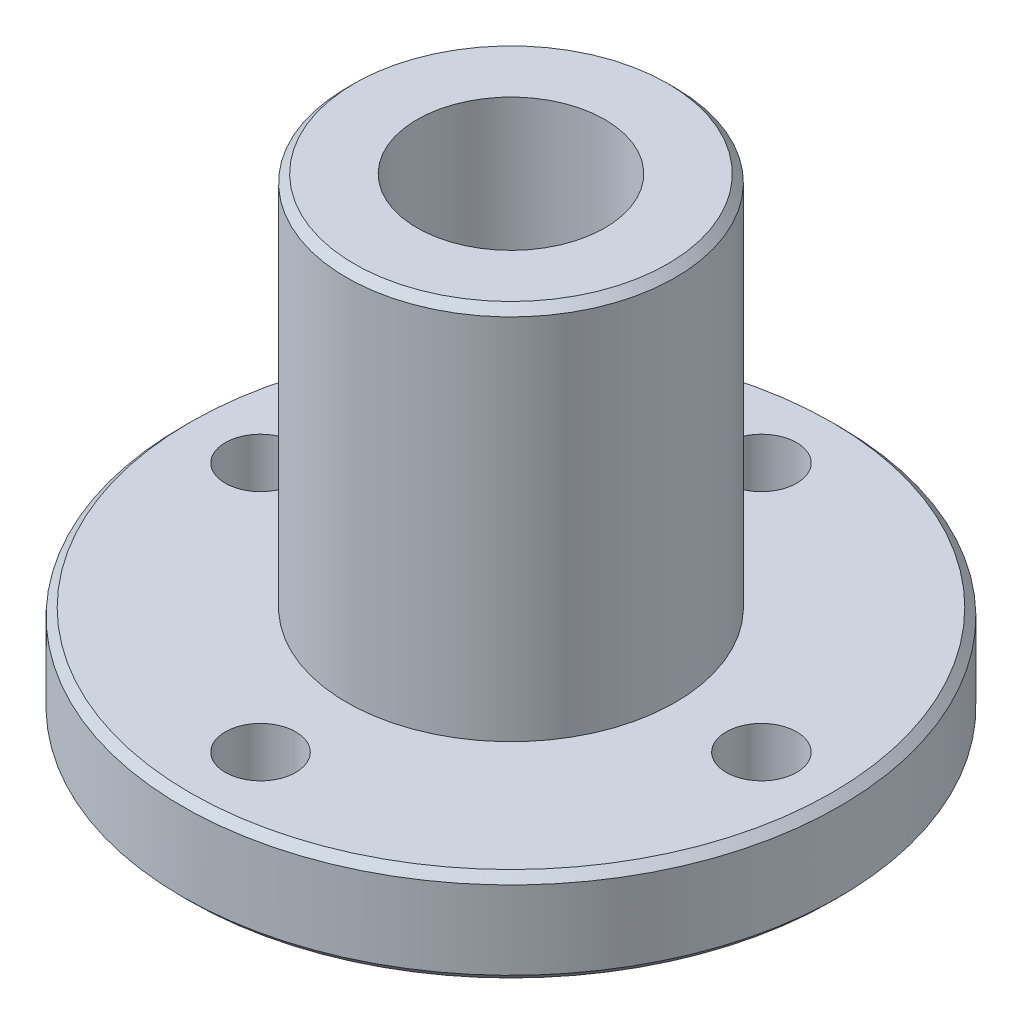
ISO-10303-21;
HEADER;
FILE_DESCRIPTION(('STEP AP214'),'2;1');
FILE_NAME('part.step','',(''),(''),'','','');
FILE_SCHEMA(('AUTOMOTIVE_DESIGN { 1 0 10303 214 1 1 1 1 }'));
ENDSEC;
DATA;
#1=APPLICATION_CONTEXT('core data for automotive mechanical design processes');
#2=APPLICATION_PROTOCOL_DEFINITION('international standard','automotive_design',2000,#1);
#3=PRODUCT_CONTEXT('',#1,'mechanical');
#4=PRODUCT('Part','Part','',(#3));
#5=PRODUCT_RELATED_PRODUCT_CATEGORY('part','',(#4));
#6=PRODUCT_DEFINITION_FORMATION('','',#4);
#7=PRODUCT_DEFINITION_CONTEXT('part definition',#1,'design');
#8=PRODUCT_DEFINITION('design','',#6,#7);
#9=PRODUCT_DEFINITION_SHAPE('','',#8);
#10=(LENGTH_UNIT() NAMED_UNIT(*) SI_UNIT(.MILLI.,.METRE.));
#11=(NAMED_UNIT(*) PLANE_ANGLE_UNIT() SI_UNIT($,.RADIAN.));
#12=(NAMED_UNIT(*) SI_UNIT($,.STERADIAN.) SOLID_ANGLE_UNIT());
#13=UNCERTAINTY_MEASURE_WITH_UNIT(LENGTH_MEASURE(1.E-05),#10,'distance_accuracy_value','');
#14=(GEOMETRIC_REPRESENTATION_CONTEXT(3) GLOBAL_UNCERTAINTY_ASSIGNED_CONTEXT((#13)) GLOBAL_UNIT_ASSIGNED_CONTEXT((#10,
#11,#12)) REPRESENTATION_CONTEXT('',''));
#15=CARTESIAN_POINT('',(0.,0.,0.));
#16=DIRECTION('',(0.,0.,1.));
#17=DIRECTION('',(1.,0.,0.));
#18=AXIS2_PLACEMENT_3D('',#15,#16,#17);
#19=CARTESIAN_POINT('',(0.,0.,0.));
#20=DIRECTION('',(0.,1.,0.));
#21=DIRECTION('',(0.,0.,1.));
#22=AXIS2_PLACEMENT_3D('',#19,#20,#21);
#23=PLANE('',#22);
#24=CARTESIAN_POINT('',(0.,0.,0.));
#25=DIRECTION('',(0.,1.,0.));
#26=DIRECTION('',(0.,0.,1.));
#27=AXIS2_PLACEMENT_3D('',#24,#25,#26);
#28=CIRCLE('',#27,20.5);
#29=CARTESIAN_POINT('',(0.,0.,20.5));
#30=VERTEX_POINT('',#29);
#31=EDGE_CURVE('E10',#30,#30,#28,.F.);
#32=ORIENTED_EDGE('',*,*,#31,.T.);
#33=EDGE_LOOP('',(#32));
#34=FACE_BOUND('',#33,.T.);
#35=CARTESIAN_POINT('',(0.,0.,-16.));
#36=DIRECTION('',(0.,1.,0.));
#37=DIRECTION('',(0.,0.,1.));
#38=AXIS2_PLACEMENT_3D('',#35,#36,#37);
#39=CIRCLE('',#38,2.24999999999999);
#40=CARTESIAN_POINT('',(0.,0.,-13.75));
#41=VERTEX_POINT('',#40);
#42=EDGE_CURVE('E87',#41,#41,#39,.T.);
#43=ORIENTED_EDGE('',*,*,#42,.T.);
#44=EDGE_LOOP('',(#43));
#45=FACE_BOUND('',#44,.T.);
#46=CARTESIAN_POINT('',(16.,0.,0.));
#47=DIRECTION('',(0.,1.,0.));
#48=DIRECTION('',(0.,0.,1.));
#49=AXIS2_PLACEMENT_3D('',#46,#47,#48);
#50=CIRCLE('',#49,2.24999999999999);
#51=CARTESIAN_POINT('',(16.,0.,2.24999999999999));
#52=VERTEX_POINT('',#51);
#53=EDGE_CURVE('E81',#52,#52,#50,.T.);
#54=ORIENTED_EDGE('',*,*,#53,.T.);
#55=EDGE_LOOP('',(#54));
#56=FACE_BOUND('',#55,.T.);
#57=CARTESIAN_POINT('',(0.,0.,16.));
#58=DIRECTION('',(0.,1.,0.));
#59=DIRECTION('',(0.,0.,1.));
#60=AXIS2_PLACEMENT_3D('',#57,#58,#59);
#61=CIRCLE('',#60,2.24999999999999);
#62=CARTESIAN_POINT('',(0.,0.,18.25));
#63=VERTEX_POINT('',#62);
#64=EDGE_CURVE('E75',#63,#63,#61,.T.);
#65=ORIENTED_EDGE('',*,*,#64,.T.);
#66=EDGE_LOOP('',(#65));
#67=FACE_BOUND('',#66,.T.);
#68=CARTESIAN_POINT('',(-16.,0.,0.));
#69=DIRECTION('',(0.,1.,0.));
#70=DIRECTION('',(0.,0.,1.));
#71=AXIS2_PLACEMENT_3D('',#68,#69,#70);
#72=CIRCLE('',#71,2.24999999999999);
#73=CARTESIAN_POINT('',(-16.,0.,2.24999999999999));
#74=VERTEX_POINT('',#73);
#75=EDGE_CURVE('E67',#74,#74,#72,.T.);
#76=ORIENTED_EDGE('',*,*,#75,.T.);
#77=EDGE_LOOP('',(#76));
#78=FACE_BOUND('',#77,.T.);
#79=CARTESIAN_POINT('',(0.,0.,0.));
#80=DIRECTION('',(0.,-1.,0.));
#81=DIRECTION('',(0.,0.,-1.));
#82=AXIS2_PLACEMENT_3D('',#79,#80,#81);
#83=CIRCLE('',#82,6.);
#84=CARTESIAN_POINT('',(0.,0.,-6.));
#85=VERTEX_POINT('',#84);
#86=EDGE_CURVE('E64',#85,#85,#83,.T.);
#87=ORIENTED_EDGE('',*,*,#86,.F.);
#88=EDGE_LOOP('',(#87));
#89=FACE_BOUND('',#88,.T.);
#90=ADVANCED_FACE('F34',(#34,#45,#56,#67,#78,#89),#23,.F.);
#91=CARTESIAN_POINT('',(0.,0.,0.));
#92=DIRECTION('',(0.,-1.,0.));
#93=DIRECTION('',(0.,0.,-1.));
#94=AXIS2_PLACEMENT_3D('',#91,#92,#93);
#95=CYLINDRICAL_SURFACE('',#94,21.);
#96=CARTESIAN_POINT('',(0.,5.5,0.));
#97=DIRECTION('',(0.,-1.,0.));
#98=DIRECTION('',(0.,0.,-1.));
#99=AXIS2_PLACEMENT_3D('',#96,#97,#98);
#100=CIRCLE('',#99,21.);
#101=CARTESIAN_POINT('',(0.,5.5,-21.));
#102=VERTEX_POINT('',#101);
#103=EDGE_CURVE('E45',#102,#102,#100,.T.);
#104=ORIENTED_EDGE('',*,*,#103,.T.);
#105=EDGE_LOOP('',(#104));
#106=FACE_BOUND('',#105,.T.);
#107=CARTESIAN_POINT('',(0.,0.500000000000003,0.));
#108=DIRECTION('',(0.,1.,0.));
#109=DIRECTION('',(0.,0.,1.));
#110=AXIS2_PLACEMENT_3D('',#107,#108,#109);
#111=CIRCLE('',#110,21.);
#112=CARTESIAN_POINT('',(0.,0.500000000000003,21.));
#113=VERTEX_POINT('',#112);
#114=EDGE_CURVE('E49',#113,#113,#111,.T.);
#115=ORIENTED_EDGE('',*,*,#114,.T.);
#116=EDGE_LOOP('',(#115));
#117=FACE_BOUND('',#116,.T.);
#118=ADVANCED_FACE('F101',(#106,#117),#95,.T.);
#119=CARTESIAN_POINT('',(-21.,6.,0.));
#120=DIRECTION('',(0.,-1.,0.));
#121=DIRECTION('',(0.,0.,-1.));
#122=AXIS2_PLACEMENT_3D('',#119,#120,#121);
#123=PLANE('',#122);
#124=CARTESIAN_POINT('',(0.,6.,0.));
#125=DIRECTION('',(0.,-1.,0.));
#126=DIRECTION('',(0.,0.,-1.));
#127=AXIS2_PLACEMENT_3D('',#124,#125,#126);
#128=CIRCLE('',#127,20.5);
#129=CARTESIAN_POINT('',(0.,6.,-20.5));
#130=VERTEX_POINT('',#129);
#131=EDGE_CURVE('E41',#130,#130,#128,.F.);
#132=ORIENTED_EDGE('',*,*,#131,.T.);
#133=EDGE_LOOP('',(#132));
#134=FACE_BOUND('',#133,.T.);
#135=CARTESIAN_POINT('',(0.,6.,-16.));
#136=DIRECTION('',(0.,1.,0.));
#137=DIRECTION('',(0.,0.,1.));
#138=AXIS2_PLACEMENT_3D('',#135,#136,#137);
#139=CIRCLE('',#138,2.24999999999999);
#140=CARTESIAN_POINT('',(0.,6.,-13.75));
#141=VERTEX_POINT('',#140);
#142=EDGE_CURVE('E90',#141,#141,#139,.T.);
#143=ORIENTED_EDGE('',*,*,#142,.F.);
#144=EDGE_LOOP('',(#143));
#145=FACE_BOUND('',#144,.T.);
#146=CARTESIAN_POINT('',(16.,6.,0.));
#147=DIRECTION('',(0.,1.,0.));
#148=DIRECTION('',(0.,0.,1.));
#149=AXIS2_PLACEMENT_3D('',#146,#147,#148);
#150=CIRCLE('',#149,2.24999999999999);
#151=CARTESIAN_POINT('',(16.,6.,2.24999999999999));
#152=VERTEX_POINT('',#151);
#153=EDGE_CURVE('E84',#152,#152,#150,.T.);
#154=ORIENTED_EDGE('',*,*,#153,.F.);
#155=EDGE_LOOP('',(#154));
#156=FACE_BOUND('',#155,.T.);
#157=CARTESIAN_POINT('',(0.,6.,16.));
#158=DIRECTION('',(0.,1.,0.));
#159=DIRECTION('',(0.,0.,1.));
#160=AXIS2_PLACEMENT_3D('',#157,#158,#159);
#161=CIRCLE('',#160,2.24999999999999);
#162=CARTESIAN_POINT('',(0.,6.,18.25));
#163=VERTEX_POINT('',#162);
#164=EDGE_CURVE('E78',#163,#163,#161,.T.);
#165=ORIENTED_EDGE('',*,*,#164,.F.);
#166=EDGE_LOOP('',(#165));
#167=FACE_BOUND('',#166,.T.);
#168=CARTESIAN_POINT('',(-16.,6.,0.));
#169=DIRECTION('',(0.,1.,0.));
#170=DIRECTION('',(0.,0.,1.));
#171=AXIS2_PLACEMENT_3D('',#168,#169,#170);
#172=CIRCLE('',#171,2.24999999999999);
#173=CARTESIAN_POINT('',(-16.,6.,2.24999999999999));
#174=VERTEX_POINT('',#173);
#175=EDGE_CURVE('E72',#174,#174,#172,.T.);
#176=ORIENTED_EDGE('',*,*,#175,.F.);
#177=EDGE_LOOP('',(#176));
#178=FACE_BOUND('',#177,.T.);
#179=CARTESIAN_POINT('',(0.,6.,0.));
#180=DIRECTION('',(0.,-1.,0.));
#181=DIRECTION('',(0.,0.,-1.));
#182=AXIS2_PLACEMENT_3D('',#179,#180,#181);
#183=CIRCLE('',#182,10.5);
#184=CARTESIAN_POINT('',(0.,6.,-10.5));
#185=VERTEX_POINT('',#184);
#186=EDGE_CURVE('E60',#185,#185,#183,.T.);
#187=ORIENTED_EDGE('',*,*,#186,.T.);
#188=EDGE_LOOP('',(#187));
#189=FACE_BOUND('',#188,.T.);
#190=ADVANCED_FACE('F97',(#134,#145,#156,#167,#178,#189),#123,.F.);
#191=CARTESIAN_POINT('',(0.,0.,0.));
#192=DIRECTION('',(0.,-1.,0.));
#193=DIRECTION('',(0.,0.,-1.));
#194=AXIS2_PLACEMENT_3D('',#191,#192,#193);
#195=CYLINDRICAL_SURFACE('',#194,10.5);
#196=CARTESIAN_POINT('',(0.,29.5,0.));
#197=DIRECTION('',(0.,-1.,0.));
#198=DIRECTION('',(0.,0.,-1.));
#199=AXIS2_PLACEMENT_3D('',#196,#197,#198);
#200=CIRCLE('',#199,10.5);
#201=CARTESIAN_POINT('',(0.,29.5,-10.5));
#202=VERTEX_POINT('',#201);
#203=EDGE_CURVE('E57',#202,#202,#200,.T.);
#204=ORIENTED_EDGE('',*,*,#203,.T.);
#205=EDGE_LOOP('',(#204));
#206=FACE_BOUND('',#205,.T.);
#207=ORIENTED_EDGE('',*,*,#186,.F.);
#208=EDGE_LOOP('',(#207));
#209=FACE_BOUND('',#208,.T.);
#210=ADVANCED_FACE('F100',(#206,#209),#195,.T.);
#211=CARTESIAN_POINT('',(-10.5,30.,0.));
#212=DIRECTION('',(0.,-1.,0.));
#213=DIRECTION('',(0.,0.,-1.));
#214=AXIS2_PLACEMENT_3D('',#211,#212,#213);
#215=PLANE('',#214);
#216=CARTESIAN_POINT('',(0.,30.,0.));
#217=DIRECTION('',(0.,-1.,0.));
#218=DIRECTION('',(0.,0.,-1.));
#219=AXIS2_PLACEMENT_3D('',#216,#217,#218);
#220=CIRCLE('',#219,10.);
#221=CARTESIAN_POINT('',(0.,30.,-10.));
#222=VERTEX_POINT('',#221);
#223=EDGE_CURVE('E54',#222,#222,#220,.F.);
#224=ORIENTED_EDGE('',*,*,#223,.T.);
#225=EDGE_LOOP('',(#224));
#226=FACE_BOUND('',#225,.T.);
#227=CARTESIAN_POINT('',(0.,30.,0.));
#228=DIRECTION('',(0.,-1.,0.));
#229=DIRECTION('',(0.,0.,-1.));
#230=AXIS2_PLACEMENT_3D('',#227,#228,#229);
#231=CIRCLE('',#230,6.);
#232=CARTESIAN_POINT('',(0.,30.,-6.));
#233=VERTEX_POINT('',#232);
#234=EDGE_CURVE('E63',#233,#233,#231,.T.);
#235=ORIENTED_EDGE('',*,*,#234,.T.);
#236=EDGE_LOOP('',(#235));
#237=FACE_BOUND('',#236,.T.);
#238=ADVANCED_FACE('F112',(#226,#237),#215,.F.);
#239=CARTESIAN_POINT('',(0.,30.,0.));
#240=DIRECTION('',(0.,-1.,0.));
#241=DIRECTION('',(0.,0.,-1.));
#242=AXIS2_PLACEMENT_3D('',#239,#240,#241);
#243=CYLINDRICAL_SURFACE('',#242,6.);
#244=ORIENTED_EDGE('',*,*,#234,.F.);
#245=EDGE_LOOP('',(#244));
#246=FACE_BOUND('',#245,.T.);
#247=ORIENTED_EDGE('',*,*,#86,.T.);
#248=EDGE_LOOP('',(#247));
#249=FACE_BOUND('',#248,.T.);
#250=ADVANCED_FACE('F118',(#246,#249),#243,.F.);
#251=CARTESIAN_POINT('',(-16.,6.,0.));
#252=DIRECTION('',(0.,1.,0.));
#253=DIRECTION('',(0.,0.,1.));
#254=AXIS2_PLACEMENT_3D('',#251,#252,#253);
#255=CYLINDRICAL_SURFACE('',#254,2.24999999999999);
#256=ORIENTED_EDGE('',*,*,#175,.T.);
#257=EDGE_LOOP('',(#256));
#258=FACE_BOUND('',#257,.T.);
#259=ORIENTED_EDGE('',*,*,#75,.F.);
#260=EDGE_LOOP('',(#259));
#261=FACE_BOUND('',#260,.T.);
#262=ADVANCED_FACE('F213',(#258,#261),#255,.F.);
#263=CARTESIAN_POINT('',(0.,6.,16.));
#264=DIRECTION('',(0.,1.,0.));
#265=DIRECTION('',(0.,0.,1.));
#266=AXIS2_PLACEMENT_3D('',#263,#264,#265);
#267=CYLINDRICAL_SURFACE('',#266,2.24999999999999);
#268=ORIENTED_EDGE('',*,*,#164,.T.);
#269=EDGE_LOOP('',(#268));
#270=FACE_BOUND('',#269,.T.);
#271=ORIENTED_EDGE('',*,*,#64,.F.);
#272=EDGE_LOOP('',(#271));
#273=FACE_BOUND('',#272,.T.);
#274=ADVANCED_FACE('F203',(#270,#273),#267,.F.);
#275=CARTESIAN_POINT('',(16.,6.,0.));
#276=DIRECTION('',(0.,1.,0.));
#277=DIRECTION('',(0.,0.,1.));
#278=AXIS2_PLACEMENT_3D('',#275,#276,#277);
#279=CYLINDRICAL_SURFACE('',#278,2.24999999999999);
#280=ORIENTED_EDGE('',*,*,#153,.T.);
#281=EDGE_LOOP('',(#280));
#282=FACE_BOUND('',#281,.T.);
#283=ORIENTED_EDGE('',*,*,#53,.F.);
#284=EDGE_LOOP('',(#283));
#285=FACE_BOUND('',#284,.T.);
#286=ADVANCED_FACE('F194',(#282,#285),#279,.F.);
#287=CARTESIAN_POINT('',(0.,6.,-16.));
#288=DIRECTION('',(0.,1.,0.));
#289=DIRECTION('',(0.,0.,1.));
#290=AXIS2_PLACEMENT_3D('',#287,#288,#289);
#291=CYLINDRICAL_SURFACE('',#290,2.24999999999999);
#292=ORIENTED_EDGE('',*,*,#142,.T.);
#293=EDGE_LOOP('',(#292));
#294=FACE_BOUND('',#293,.T.);
#295=ORIENTED_EDGE('',*,*,#42,.F.);
#296=EDGE_LOOP('',(#295));
#297=FACE_BOUND('',#296,.T.);
#298=ADVANCED_FACE('F94',(#294,#297),#291,.F.);
#299=CARTESIAN_POINT('',(0.,29.5,0.));
#300=DIRECTION('',(0.,-1.,0.));
#301=DIRECTION('',(0.,0.,-1.));
#302=AXIS2_PLACEMENT_3D('',#299,#300,#301);
#303=CONICAL_SURFACE('',#302,10.5,0.78539816339746);
#304=ORIENTED_EDGE('',*,*,#223,.F.);
#305=EDGE_LOOP('',(#304));
#306=FACE_BOUND('',#305,.T.);
#307=ORIENTED_EDGE('',*,*,#203,.F.);
#308=EDGE_LOOP('',(#307));
#309=FACE_BOUND('',#308,.T.);
#310=ADVANCED_FACE('F130',(#306,#309),#303,.T.);
#311=CARTESIAN_POINT('',(0.,5.5,0.));
#312=DIRECTION('',(0.,-1.,0.));
#313=DIRECTION('',(0.,0.,-1.));
#314=AXIS2_PLACEMENT_3D('',#311,#312,#313);
#315=CONICAL_SURFACE('',#314,21.,0.785398163397448);
#316=ORIENTED_EDGE('',*,*,#131,.F.);
#317=EDGE_LOOP('',(#316));
#318=FACE_BOUND('',#317,.T.);
#319=ORIENTED_EDGE('',*,*,#103,.F.);
#320=EDGE_LOOP('',(#319));
#321=FACE_BOUND('',#320,.T.);
#322=ADVANCED_FACE('F132',(#318,#321),#315,.T.);
#323=CARTESIAN_POINT('',(0.,0.,0.));
#324=DIRECTION('',(0.,1.,0.));
#325=DIRECTION('',(0.,0.,1.));
#326=AXIS2_PLACEMENT_3D('',#323,#324,#325);
#327=CONICAL_SURFACE('',#326,20.5,0.785398163397448);
#328=ORIENTED_EDGE('',*,*,#114,.F.);
#329=EDGE_LOOP('',(#328));
#330=FACE_BOUND('',#329,.T.);
#331=ORIENTED_EDGE('',*,*,#31,.F.);
#332=EDGE_LOOP('',(#331));
#333=FACE_BOUND('',#332,.T.);
#334=ADVANCED_FACE('F36',(#330,#333),#327,.T.);
#335=CLOSED_SHELL('',(#90,#118,#190,#210,#238,#250,#262,#274,#286,#298,#310,#322,#334));
#336=MANIFOLD_SOLID_BREP('B2',#335);
#337=ADVANCED_BREP_SHAPE_REPRESENTATION('',(#18,#336),#14);
#338=SHAPE_DEFINITION_REPRESENTATION(#9,#337);
ENDSEC;
END-ISO-10303-21;
